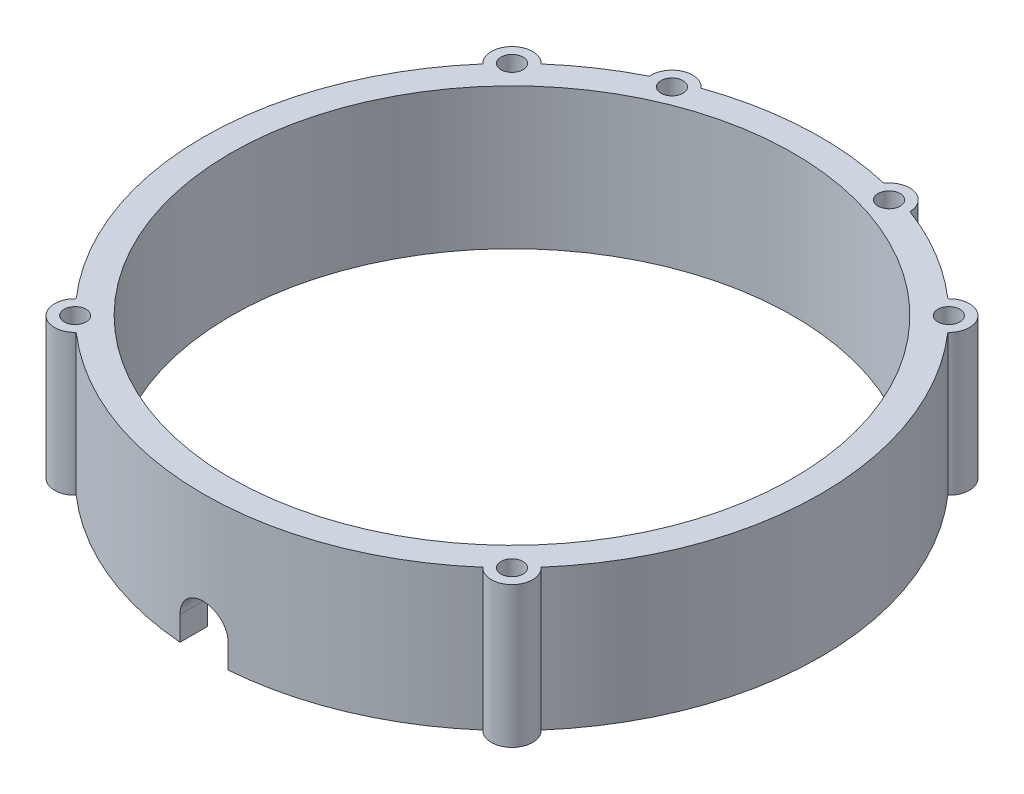
ISO-10303-21;
HEADER;
FILE_DESCRIPTION(('STEP AP214'),'2;1');
FILE_NAME('part.step','',(''),(''),'','','');
FILE_SCHEMA(('AUTOMOTIVE_DESIGN { 1 0 10303 214 1 1 1 1 }'));
ENDSEC;
DATA;
#1=APPLICATION_CONTEXT('core data for automotive mechanical design processes');
#2=APPLICATION_PROTOCOL_DEFINITION('international standard','automotive_design',2000,#1);
#3=PRODUCT_CONTEXT('',#1,'mechanical');
#4=PRODUCT('Part','Part','',(#3));
#5=PRODUCT_RELATED_PRODUCT_CATEGORY('part','',(#4));
#6=PRODUCT_DEFINITION_FORMATION('','',#4);
#7=PRODUCT_DEFINITION_CONTEXT('part definition',#1,'design');
#8=PRODUCT_DEFINITION('design','',#6,#7);
#9=PRODUCT_DEFINITION_SHAPE('','',#8);
#10=(LENGTH_UNIT() NAMED_UNIT(*) SI_UNIT(.MILLI.,.METRE.));
#11=(NAMED_UNIT(*) PLANE_ANGLE_UNIT() SI_UNIT($,.RADIAN.));
#12=(NAMED_UNIT(*) SI_UNIT($,.STERADIAN.) SOLID_ANGLE_UNIT());
#13=UNCERTAINTY_MEASURE_WITH_UNIT(LENGTH_MEASURE(1.E-05),#10,'distance_accuracy_value','');
#14=(GEOMETRIC_REPRESENTATION_CONTEXT(3) GLOBAL_UNCERTAINTY_ASSIGNED_CONTEXT((#13)) GLOBAL_UNIT_ASSIGNED_CONTEXT((#10,
#11,#12)) REPRESENTATION_CONTEXT('',''));
#15=CARTESIAN_POINT('',(0.,0.,0.));
#16=DIRECTION('',(0.,0.,1.));
#17=DIRECTION('',(1.,0.,0.));
#18=AXIS2_PLACEMENT_3D('',#15,#16,#17);
#19=CARTESIAN_POINT('',(0.,0.,0.));
#20=DIRECTION('',(0.,1.,0.));
#21=DIRECTION('',(0.,0.,1.));
#22=AXIS2_PLACEMENT_3D('',#19,#20,#21);
#23=PLANE('',#22);
#24=CARTESIAN_POINT('',(-17.1530965406792,0.,-40.4101630665621));
#25=DIRECTION('',(0.,1.,0.));
#26=DIRECTION('',(0.,0.,1.));
#27=AXIS2_PLACEMENT_3D('',#24,#25,#26);
#28=CIRCLE('',#27,1.6);
#29=CARTESIAN_POINT('',(-17.1530965406792,0.,-38.8101630665621));
#30=VERTEX_POINT('',#29);
#31=EDGE_CURVE('E250',#30,#30,#28,.T.);
#32=ORIENTED_EDGE('',*,*,#31,.T.);
#33=EDGE_LOOP('',(#32));
#34=FACE_BOUND('',#33,.T.);
#35=CARTESIAN_POINT('',(12.8351178373282,0.,-41.9817787867772));
#36=DIRECTION('',(0.,1.,0.));
#37=DIRECTION('',(0.,0.,1.));
#38=AXIS2_PLACEMENT_3D('',#35,#36,#37);
#39=CIRCLE('',#38,1.6);
#40=CARTESIAN_POINT('',(12.8351178373282,0.,-40.3817787867772));
#41=VERTEX_POINT('',#40);
#42=EDGE_CURVE('E254',#41,#41,#39,.T.);
#43=ORIENTED_EDGE('',*,*,#42,.T.);
#44=EDGE_LOOP('',(#43));
#45=FACE_BOUND('',#44,.T.);
#46=CARTESIAN_POINT('',(-31.7490944752759,0.,-31.749094475276));
#47=DIRECTION('',(0.,1.,0.));
#48=DIRECTION('',(0.,0.,1.));
#49=AXIS2_PLACEMENT_3D('',#46,#47,#48);
#50=CIRCLE('',#49,1.6);
#51=CARTESIAN_POINT('',(-31.7490944752759,0.,-30.149094475276));
#52=VERTEX_POINT('',#51);
#53=EDGE_CURVE('E258',#52,#52,#50,.T.);
#54=ORIENTED_EDGE('',*,*,#53,.T.);
#55=EDGE_LOOP('',(#54));
#56=FACE_BOUND('',#55,.T.);
#57=CARTESIAN_POINT('',(-31.749094475276,0.,31.7490944752759));
#58=DIRECTION('',(0.,1.,0.));
#59=DIRECTION('',(0.,0.,1.));
#60=AXIS2_PLACEMENT_3D('',#57,#58,#59);
#61=CIRCLE('',#60,1.6);
#62=CARTESIAN_POINT('',(-31.749094475276,0.,33.3490944752759));
#63=VERTEX_POINT('',#62);
#64=EDGE_CURVE('E262',#63,#63,#61,.T.);
#65=ORIENTED_EDGE('',*,*,#64,.T.);
#66=EDGE_LOOP('',(#65));
#67=FACE_BOUND('',#66,.T.);
#68=CARTESIAN_POINT('',(31.7490944752759,0.,31.749094475276));
#69=DIRECTION('',(0.,1.,0.));
#70=DIRECTION('',(0.,0.,1.));
#71=AXIS2_PLACEMENT_3D('',#68,#69,#70);
#72=CIRCLE('',#71,1.6);
#73=CARTESIAN_POINT('',(31.7490944752759,0.,33.349094475276));
#74=VERTEX_POINT('',#73);
#75=EDGE_CURVE('E266',#74,#74,#72,.T.);
#76=ORIENTED_EDGE('',*,*,#75,.T.);
#77=EDGE_LOOP('',(#76));
#78=FACE_BOUND('',#77,.T.);
#79=CARTESIAN_POINT('',(31.749094475276,0.,-31.7490944752759));
#80=DIRECTION('',(0.,1.,0.));
#81=DIRECTION('',(0.,0.,1.));
#82=AXIS2_PLACEMENT_3D('',#79,#80,#81);
#83=CIRCLE('',#82,1.6);
#84=CARTESIAN_POINT('',(31.749094475276,0.,-30.1490944752759));
#85=VERTEX_POINT('',#84);
#86=EDGE_CURVE('E269',#85,#85,#83,.T.);
#87=ORIENTED_EDGE('',*,*,#86,.T.);
#88=EDGE_LOOP('',(#87));
#89=FACE_BOUND('',#88,.T.);
#90=DIRECTION('',(0.,0.,-1.));
#91=VECTOR('',#90,1.);
#92=CARTESIAN_POINT('',(-3.5,0.,44.9));
#93=LINE('',#92,#91);
#94=CARTESIAN_POINT('',(-3.5,0.,44.7633778886268));
#95=VERTEX_POINT('',#94);
#96=CARTESIAN_POINT('',(-3.5,0.,40.7499693251418));
#97=VERTEX_POINT('',#96);
#98=EDGE_CURVE('E273',#95,#97,#93,.T.);
#99=ORIENTED_EDGE('',*,*,#98,.F.);
#100=CARTESIAN_POINT('',(0.,0.,0.));
#101=DIRECTION('',(0.,1.,0.));
#102=DIRECTION('',(0.,0.,1.));
#103=AXIS2_PLACEMENT_3D('',#100,#101,#102);
#104=CIRCLE('',#103,44.9);
#105=CARTESIAN_POINT('',(-29.5580900659073,0.,33.7983625587943));
#106=VERTEX_POINT('',#105);
#107=EDGE_CURVE('E274',#106,#95,#104,.T.);
#108=ORIENTED_EDGE('',*,*,#107,.F.);
#109=CARTESIAN_POINT('',(-31.749094475276,0.,31.7490944752759));
#110=DIRECTION('',(0.,1.,0.));
#111=DIRECTION('',(0.,0.,1.));
#112=AXIS2_PLACEMENT_3D('',#109,#110,#111);
#113=CIRCLE('',#112,3.00000000000016);
#114=CARTESIAN_POINT('',(-33.7983625587944,0.,29.5580900659072));
#115=VERTEX_POINT('',#114);
#116=EDGE_CURVE('E374',#106,#115,#113,.F.);
#117=ORIENTED_EDGE('',*,*,#116,.T.);
#118=CARTESIAN_POINT('',(0.,0.,0.));
#119=DIRECTION('',(0.,1.,0.));
#120=DIRECTION('',(0.,0.,1.));
#121=AXIS2_PLACEMENT_3D('',#118,#119,#120);
#122=CIRCLE('',#121,44.9);
#123=CARTESIAN_POINT('',(-33.7983625587945,0.,-29.5580900659072));
#124=VERTEX_POINT('',#123);
#125=EDGE_CURVE('E285',#124,#115,#122,.T.);
#126=ORIENTED_EDGE('',*,*,#125,.F.);
#127=CARTESIAN_POINT('',(-31.7490944752759,0.,-31.749094475276));
#128=DIRECTION('',(0.,1.,0.));
#129=DIRECTION('',(0.,0.,1.));
#130=AXIS2_PLACEMENT_3D('',#127,#128,#129);
#131=CIRCLE('',#130,3.00000000000023);
#132=CARTESIAN_POINT('',(-29.558090065907,0.,-33.7983625587946));
#133=VERTEX_POINT('',#132);
#134=EDGE_CURVE('E83',#124,#133,#131,.F.);
#135=ORIENTED_EDGE('',*,*,#134,.T.);
#136=CARTESIAN_POINT('',(0.,0.,0.));
#137=DIRECTION('',(0.,1.,0.));
#138=DIRECTION('',(0.,0.,1.));
#139=AXIS2_PLACEMENT_3D('',#136,#137,#138);
#140=CIRCLE('',#139,44.9);
#141=CARTESIAN_POINT('',(-20.1399570386959,0.,-40.1296913828089));
#142=VERTEX_POINT('',#141);
#143=EDGE_CURVE('E192',#142,#133,#140,.T.);
#144=ORIENTED_EDGE('',*,*,#143,.F.);
#145=CARTESIAN_POINT('',(-17.1530965406792,0.,-40.4101630665621));
#146=DIRECTION('',(0.,1.,0.));
#147=DIRECTION('',(0.,0.,1.));
#148=AXIS2_PLACEMENT_3D('',#145,#146,#147);
#149=CIRCLE('',#148,2.99999999999996);
#150=CARTESIAN_POINT('',(-14.8764944493469,0.,-42.3638986980489));
#151=VERTEX_POINT('',#150);
#152=EDGE_CURVE('E301',#151,#142,#149,.T.);
#153=ORIENTED_EDGE('',*,*,#152,.F.);
#154=CARTESIAN_POINT('',(0.,0.,0.));
#155=DIRECTION('',(0.,1.,0.));
#156=DIRECTION('',(0.,0.,1.));
#157=AXIS2_PLACEMENT_3D('',#154,#155,#156);
#158=CIRCLE('',#157,44.9);
#159=CARTESIAN_POINT('',(10.3667662272664,0.,-43.6868419319732));
#160=VERTEX_POINT('',#159);
#161=EDGE_CURVE('E189',#160,#151,#158,.T.);
#162=ORIENTED_EDGE('',*,*,#161,.F.);
#163=CARTESIAN_POINT('',(12.8351178373282,0.,-41.9817787867772));
#164=DIRECTION('',(0.,1.,0.));
#165=DIRECTION('',(0.,0.,1.));
#166=AXIS2_PLACEMENT_3D('',#163,#164,#165);
#167=CIRCLE('',#166,2.99999999999996);
#168=CARTESIAN_POINT('',(15.8349332751091,0.,-42.0150554941064));
#169=VERTEX_POINT('',#168);
#170=EDGE_CURVE('E299',#169,#160,#167,.T.);
#171=ORIENTED_EDGE('',*,*,#170,.F.);
#172=CARTESIAN_POINT('',(0.,0.,0.));
#173=DIRECTION('',(0.,1.,0.));
#174=DIRECTION('',(0.,0.,1.));
#175=AXIS2_PLACEMENT_3D('',#172,#173,#174);
#176=CIRCLE('',#175,44.9);
#177=CARTESIAN_POINT('',(29.5580900659073,0.,-33.7983625587944));
#178=VERTEX_POINT('',#177);
#179=EDGE_CURVE('E297',#178,#169,#176,.T.);
#180=ORIENTED_EDGE('',*,*,#179,.F.);
#181=CARTESIAN_POINT('',(31.749094475276,0.,-31.7490944752759));
#182=DIRECTION('',(0.,1.,0.));
#183=DIRECTION('',(0.,0.,1.));
#184=AXIS2_PLACEMENT_3D('',#181,#182,#183);
#185=CIRCLE('',#184,3.00000000000001);
#186=CARTESIAN_POINT('',(33.7983625587945,0.,-29.5580900659072));
#187=VERTEX_POINT('',#186);
#188=EDGE_CURVE('E383',#178,#187,#185,.F.);
#189=ORIENTED_EDGE('',*,*,#188,.T.);
#190=CARTESIAN_POINT('',(0.,0.,0.));
#191=DIRECTION('',(0.,1.,0.));
#192=DIRECTION('',(0.,0.,1.));
#193=AXIS2_PLACEMENT_3D('',#190,#191,#192);
#194=CIRCLE('',#193,44.9);
#195=CARTESIAN_POINT('',(33.7983625587944,0.,29.5580900659073));
#196=VERTEX_POINT('',#195);
#197=EDGE_CURVE('E289',#196,#187,#194,.T.);
#198=ORIENTED_EDGE('',*,*,#197,.F.);
#199=CARTESIAN_POINT('',(31.7490944752759,0.,31.749094475276));
#200=DIRECTION('',(0.,1.,0.));
#201=DIRECTION('',(0.,0.,1.));
#202=AXIS2_PLACEMENT_3D('',#199,#200,#201);
#203=CIRCLE('',#202,3.00000000000008);
#204=CARTESIAN_POINT('',(29.5580900659072,0.,33.7983625587945));
#205=VERTEX_POINT('',#204);
#206=EDGE_CURVE('E378',#196,#205,#203,.F.);
#207=ORIENTED_EDGE('',*,*,#206,.T.);
#208=CARTESIAN_POINT('',(3.5,0.,44.7633778886268));
#209=VERTEX_POINT('',#208);
#210=EDGE_CURVE('E286',#209,#205,#104,.T.);
#211=ORIENTED_EDGE('',*,*,#210,.F.);
#212=DIRECTION('',(0.,0.,-1.));
#213=VECTOR('',#212,1.);
#214=CARTESIAN_POINT('',(3.5,0.,44.9));
#215=LINE('',#214,#213);
#216=CARTESIAN_POINT('',(3.5,0.,40.7499693251418));
#217=VERTEX_POINT('',#216);
#218=EDGE_CURVE('E75',#209,#217,#215,.T.);
#219=ORIENTED_EDGE('',*,*,#218,.T.);
#220=CARTESIAN_POINT('',(0.,0.,0.));
#221=DIRECTION('',(0.,1.,0.));
#222=DIRECTION('',(0.,0.,1.));
#223=AXIS2_PLACEMENT_3D('',#220,#221,#222);
#224=CIRCLE('',#223,40.9);
#225=EDGE_CURVE('E276',#217,#97,#224,.T.);
#226=ORIENTED_EDGE('',*,*,#225,.T.);
#227=EDGE_LOOP('',(#99,#108,#117,#126,#135,#144,#153,#162,#171,#180,#189,#198,#207,#211,#219,#226));
#228=FACE_BOUND('',#227,.T.);
#229=ADVANCED_FACE('F61',(#34,#45,#56,#67,#78,#89,#228),#23,.F.);
#230=CARTESIAN_POINT('',(0.,20.5,0.));
#231=DIRECTION('',(0.,-1.,0.));
#232=DIRECTION('',(0.,0.,-1.));
#233=AXIS2_PLACEMENT_3D('',#230,#231,#232);
#234=CYLINDRICAL_SURFACE('',#233,40.9);
#235=CARTESIAN_POINT('',(0.,20.5,0.));
#236=DIRECTION('',(0.,1.,0.));
#237=DIRECTION('',(0.,0.,1.));
#238=AXIS2_PLACEMENT_3D('',#235,#236,#237);
#239=CIRCLE('',#238,40.9);
#240=CARTESIAN_POINT('',(0.,20.5,40.9));
#241=VERTEX_POINT('',#240);
#242=EDGE_CURVE('E291',#241,#241,#239,.T.);
#243=ORIENTED_EDGE('',*,*,#242,.T.);
#244=EDGE_LOOP('',(#243));
#245=FACE_BOUND('',#244,.T.);
#246=CARTESIAN_POINT('',(3.5,3.5,40.7499693251418));
#247=CARTESIAN_POINT('',(3.50000964048092,3.59824909595129,40.749965842796));
#248=CARTESIAN_POINT('',(3.49586309882002,3.6964934745691,40.7503245730504));
#249=CARTESIAN_POINT('',(3.47933229120163,3.89227581227809,40.7517407338276));
#250=CARTESIAN_POINT('',(3.46694853151288,3.98981381441155,40.7527981214102));
#251=CARTESIAN_POINT('',(3.43403195642768,4.18341604896146,40.7555846887573));
#252=CARTESIAN_POINT('',(3.41350610156376,4.27948146759436,40.7573132946826));
#253=CARTESIAN_POINT('',(3.36447463084468,4.46951172588773,40.7613899407994));
#254=CARTESIAN_POINT('',(3.33596908892979,4.56347658500341,40.7637379752512));
#255=CARTESIAN_POINT('',(3.23872360136853,4.8413004568433,40.771619643036));
#256=CARTESIAN_POINT('',(3.15823856935434,5.02118364135841,40.777992301763));
#257=CARTESIAN_POINT('',(2.96837303193688,5.36476235218107,40.7922512329031));
#258=CARTESIAN_POINT('',(2.85899659413601,5.52846015276317,40.8001372922029));
#259=CARTESIAN_POINT('',(2.61411506768439,5.83560318623674,40.816558601666));
#260=CARTESIAN_POINT('',(2.4785503330118,5.97900086673616,40.82509530633));
#261=CARTESIAN_POINT('',(2.18525779678196,6.24104642540193,40.841843498283));
#262=CARTESIAN_POINT('',(2.0275266267288,6.35969053510023,40.8500549358998));
#263=CARTESIAN_POINT('',(1.69409556703837,6.56901322890935,40.8652406224087));
#264=CARTESIAN_POINT('',(1.5183690361253,6.65964952802438,40.8722129939341));
#265=CARTESIAN_POINT('',(1.15413303232907,6.8101056987528,40.8841184594225));
#266=CARTESIAN_POINT('',(0.965624570891555,6.86992800549212,40.8890517145241));
#267=CARTESIAN_POINT('',(0.581655814625003,6.95692512339592,40.8963132582187));
#268=CARTESIAN_POINT('',(0.3862136861428,6.98417957347958,40.8986479002963));
#269=CARTESIAN_POINT('',(-0.00648882199237249,7.00551348326747,40.9004707320439));
#270=CARTESIAN_POINT('',(-0.203749210773618,6.99959277633064,40.899958907416));
#271=CARTESIAN_POINT('',(-0.593937852867385,6.95480839186038,40.8961516085632));
#272=CARTESIAN_POINT('',(-0.786876127210241,6.91603131467869,40.8928634520649));
#273=CARTESIAN_POINT('',(-1.16349461085666,6.80676973727158,40.883881738657));
#274=CARTESIAN_POINT('',(-1.34717477241873,6.73628507355762,40.8781881693447));
#275=CARTESIAN_POINT('',(-1.70034273168692,6.56551126813345,40.8650233971963));
#276=CARTESIAN_POINT('',(-1.8698114189533,6.46518279336582,40.8575498510228));
#277=CARTESIAN_POINT('',(-2.189528531622,6.23760241788658,40.8416653177443));
#278=CARTESIAN_POINT('',(-2.33977742444571,6.11035117213094,40.8332543534466));
#279=CARTESIAN_POINT('',(-2.61728543737407,5.83207011346642,40.8164090153748));
#280=CARTESIAN_POINT('',(-2.7444724566926,5.68096839764916,40.8079746491316));
#281=CARTESIAN_POINT('',(-2.9717262837295,5.35946127711144,40.7920564292353));
#282=CARTESIAN_POINT('',(-3.07178474606407,5.18904995510817,40.7845728684478));
#283=CARTESIAN_POINT('',(-3.24193509477707,4.83368751845717,40.7714014180471));
#284=CARTESIAN_POINT('',(-3.31200505210223,4.64872588051051,40.7657148432699));
#285=CARTESIAN_POINT('',(-3.41996920170108,4.26974302575383,40.7568005895101));
#286=CARTESIAN_POINT('',(-3.45791218300174,4.07573602001078,40.7535691828021));
#287=CARTESIAN_POINT('',(-3.48619850630497,3.81699106052656,40.7511525795988));
#288=CARTESIAN_POINT('',(-3.49137668341357,3.75364822686948,40.7507091245758));
#289=CARTESIAN_POINT('',(-3.49827274151485,3.62687899817979,40.7501178708733));
#290=CARTESIAN_POINT('',(-3.49999638097419,3.56345291885567,40.7499695801789));
#291=CARTESIAN_POINT('',(-3.5,3.5,40.7499693251418));
#292=B_SPLINE_CURVE_WITH_KNOTS('',3,(#246,#247,#248,#249,#250,#251,#252,#253,#254,#255,#256,
#257,#258,#259,#260,#261,#262,#263,#264,#265,#266,#267,#268,#269,#270,#271,#272,#273,#274,#275,
#276,#277,#278,#279,#280,#281,#282,#283,#284,#285,#286,#287,#288,#289,#290,#291),.UNSPECIFIED.,
.F.,.F.,(4,2,2,2,2,2,2,2,2,2,2,2,2,2,2,2,2,2,2,2,2,2,4),(0.,0.294650714459899,0.589283321026421,
0.883664592366965,1.17804313604296,1.76651506364897,2.35490418479021,2.9446495566645,
3.53448464559534,4.12520593995873,4.71588054444503,5.30510778367457,5.89433798263518,
6.48201994670111,7.06970494096827,7.65816794060906,8.24661662623089,8.83687446029531,
9.42731366609712,10.0181838951009,10.6081551925136,10.7987547004879,10.989036227611),.UNSPECIFIED.);
#293=CARTESIAN_POINT('',(3.5,3.5,40.7499693251418));
#294=VERTEX_POINT('',#293);
#295=CARTESIAN_POINT('',(-3.5,3.5,40.7499693251418));
#296=VERTEX_POINT('',#295);
#297=EDGE_CURVE('E185',#294,#296,#292,.T.);
#298=ORIENTED_EDGE('',*,*,#297,.T.);
#299=DIRECTION('',(0.,-1.,0.));
#300=VECTOR('',#299,1.);
#301=CARTESIAN_POINT('',(-3.5,20.5,40.7499693251418));
#302=LINE('',#301,#300);
#303=EDGE_CURVE('E222',#296,#97,#302,.T.);
#304=ORIENTED_EDGE('',*,*,#303,.T.);
#305=ORIENTED_EDGE('',*,*,#225,.F.);
#306=DIRECTION('',(0.,-1.,0.));
#307=VECTOR('',#306,1.);
#308=CARTESIAN_POINT('',(3.5,20.5,40.7499693251418));
#309=LINE('',#308,#307);
#310=EDGE_CURVE('E653',#217,#294,#309,.F.);
#311=ORIENTED_EDGE('',*,*,#310,.T.);
#312=EDGE_LOOP('',(#298,#304,#305,#311));
#313=FACE_BOUND('',#312,.T.);
#314=ADVANCED_FACE('F225',(#245,#313),#234,.F.);
#315=CARTESIAN_POINT('',(0.,-4.5,0.));
#316=DIRECTION('',(0.,1.,0.));
#317=DIRECTION('',(0.,0.,1.));
#318=AXIS2_PLACEMENT_3D('',#315,#316,#317);
#319=CYLINDRICAL_SURFACE('',#318,44.9);
#320=DIRECTION('',(0.,1.,0.));
#321=VECTOR('',#320,1.);
#322=CARTESIAN_POINT('',(-3.5,-4.5,44.7633778886268));
#323=LINE('',#322,#321);
#324=CARTESIAN_POINT('',(-3.5,3.5,44.7633778886268));
#325=VERTEX_POINT('',#324);
#326=EDGE_CURVE('E12',#95,#325,#323,.T.);
#327=ORIENTED_EDGE('',*,*,#326,.T.);
#328=CARTESIAN_POINT('',(-3.5,3.5,44.7633778886268));
#329=CARTESIAN_POINT('',(-3.50000960474246,3.59828171982175,44.7633747208575));
#330=CARTESIAN_POINT('',(-3.49586034826426,3.69655876405734,44.7637015006138));
#331=CARTESIAN_POINT('',(-3.4793184710148,3.89240680463495,44.7649915561636));
#332=CARTESIAN_POINT('',(-3.4669263377296,3.98997784238547,44.7659547943169));
#333=CARTESIAN_POINT('',(-3.43398668263772,4.18364879850476,44.7684933220832));
#334=CARTESIAN_POINT('',(-3.41344591768482,4.27974986737787,44.7700681045802));
#335=CARTESIAN_POINT('',(-3.36437794371068,4.46985114531916,44.7737820678763));
#336=CARTESIAN_POINT('',(-3.33585081263611,4.56385137488179,44.7759212431667));
#337=CARTESIAN_POINT('',(-3.23852912061639,4.84178232482582,44.7831020607386));
#338=CARTESIAN_POINT('',(-3.15797840212347,5.02173601956829,44.788908294715));
#339=CARTESIAN_POINT('',(-2.96795250729651,5.36544134164519,44.8019002210702));
#340=CARTESIAN_POINT('',(-2.85848167626447,5.52919539792998,44.8090857061696));
#341=CARTESIAN_POINT('',(-2.61343506049279,5.83636610914623,44.8240450387007));
#342=CARTESIAN_POINT('',(-2.47780966099231,5.97974319683933,44.8318199870465));
#343=CARTESIAN_POINT('',(-2.18439915685326,6.24173254690161,44.8470727855947));
#344=CARTESIAN_POINT('',(-2.02661068406102,6.3603410383265,44.8545505904178));
#345=CARTESIAN_POINT('',(-1.69312208733441,6.56954835007493,44.8683761788688));
#346=CARTESIAN_POINT('',(-1.51740003993265,6.66011232770159,44.8747225526807));
#347=CARTESIAN_POINT('',(-1.15319741077576,6.81042932323622,44.8855576901581));
#348=CARTESIAN_POINT('',(-0.964717805627964,6.87018469657127,44.8900465958285));
#349=CARTESIAN_POINT('',(-0.580746484207755,6.95707978419725,44.896653646246));
#350=CARTESIAN_POINT('',(-0.385269791588704,6.98428551348533,44.8987765888788));
#351=CARTESIAN_POINT('',(0.00749106443814212,7.00551299815313,44.9004287708202));
#352=CARTESIAN_POINT('',(0.204775242419055,6.99953448574449,44.8999579891982));
#353=CARTESIAN_POINT('',(0.595092566471804,6.95461619334253,44.8964796440063));
#354=CARTESIAN_POINT('',(0.788134049970819,6.91574837273816,44.8934776186624));
#355=CARTESIAN_POINT('',(1.16494379372431,6.80626672219239,44.8852809322363));
#356=CARTESIAN_POINT('',(1.34871201873726,6.73565277161502,44.8800862628221));
#357=CARTESIAN_POINT('',(1.70199277888392,6.56460121429222,44.8680791800231));
#358=CARTESIAN_POINT('',(1.87148929792201,6.46413065936686,44.8612649810827));
#359=CARTESIAN_POINT('',(2.19123160829209,6.23624641923475,44.8467853759798));
#360=CARTESIAN_POINT('',(2.34147794913615,6.10883350339501,44.8391199941267));
#361=CARTESIAN_POINT('',(2.61886455442493,5.83029622846735,44.8237764714614));
#362=CARTESIAN_POINT('',(2.74594543845943,5.67911273333173,44.8160983473912));
#363=CARTESIAN_POINT('',(2.97297258122708,5.35746709132314,44.8016118259601));
#364=CARTESIAN_POINT('',(3.07291044343098,5.18699900192559,44.7948036980713));
#365=CARTESIAN_POINT('',(3.24280796962679,4.8315604204994,44.7828257691834));
#366=CARTESIAN_POINT('',(3.31274657128627,4.64657984676228,44.7776571199151));
#367=CARTESIAN_POINT('',(3.42045056804077,4.26759271096918,44.7695597889626));
#368=CARTESIAN_POINT('',(3.45826480519031,4.07360032590709,44.7666277074842));
#369=CARTESIAN_POINT('',(3.48635165661392,3.81523073526899,44.7644431198624));
#370=CARTESIAN_POINT('',(3.49147239473944,3.75223833281094,44.7640438906619));
#371=CARTESIAN_POINT('',(3.49829192248696,3.6261726098262,44.7635116149658));
#372=CARTESIAN_POINT('',(3.49999639902261,3.56309959896164,44.7633781261055));
#373=CARTESIAN_POINT('',(3.5,3.5,44.7633778886268));
#374=B_SPLINE_CURVE_WITH_KNOTS('',3,(#328,#329,#330,#331,#332,#333,#334,#335,#336,#337,#338,
#339,#340,#341,#342,#343,#344,#345,#346,#347,#348,#349,#350,#351,#352,#353,#354,#355,#356,#357,
#358,#359,#360,#361,#362,#363,#364,#365,#366,#367,#368,#369,#370,#371,#372,#373),.UNSPECIFIED.,
.F.,.F.,(4,2,2,2,2,2,2,2,2,2,2,2,2,2,2,2,2,2,2,2,2,2,4),(0.,0.294748677234381,0.589479924498616,
0.883967289435624,1.17845178028568,1.7671421103556,2.35574403883908,2.94547371814697,
3.53529311667219,4.12584239776252,4.71634652256789,5.30565098542284,5.8949602038209,
6.48298338088558,7.07100879246993,7.65968554313867,8.24834548580258,8.83849375953549,
9.42882438466605,10.0195688022804,10.6094134332371,10.7989517008767,10.9881741888364),.UNSPECIFIED.);
#375=CARTESIAN_POINT('',(3.5,3.5,44.7633778886268));
#376=VERTEX_POINT('',#375);
#377=EDGE_CURVE('E179',#325,#376,#374,.T.);
#378=ORIENTED_EDGE('',*,*,#377,.T.);
#379=DIRECTION('',(0.,1.,0.));
#380=VECTOR('',#379,1.);
#381=CARTESIAN_POINT('',(3.5,-4.5,44.7633778886268));
#382=LINE('',#381,#380);
#383=EDGE_CURVE('E68',#376,#209,#382,.F.);
#384=ORIENTED_EDGE('',*,*,#383,.T.);
#385=ORIENTED_EDGE('',*,*,#210,.T.);
#386=DIRECTION('',(0.,1.,0.));
#387=VECTOR('',#386,1.);
#388=CARTESIAN_POINT('',(29.5580900659072,-4.5,33.7983625587945));
#389=LINE('',#388,#387);
#390=CARTESIAN_POINT('',(29.5580900659072,20.5,33.7983625587945));
#391=VERTEX_POINT('',#390);
#392=EDGE_CURVE('E357',#205,#391,#389,.T.);
#393=ORIENTED_EDGE('',*,*,#392,.T.);
#394=CARTESIAN_POINT('',(0.,20.5,0.));
#395=DIRECTION('',(0.,1.,0.));
#396=DIRECTION('',(0.,0.,1.));
#397=AXIS2_PLACEMENT_3D('',#394,#395,#396);
#398=CIRCLE('',#397,44.9);
#399=CARTESIAN_POINT('',(-29.5580900659073,20.5,33.7983625587943));
#400=VERTEX_POINT('',#399);
#401=EDGE_CURVE('E354',#400,#391,#398,.T.);
#402=ORIENTED_EDGE('',*,*,#401,.F.);
#403=DIRECTION('',(0.,1.,0.));
#404=VECTOR('',#403,1.);
#405=CARTESIAN_POINT('',(-29.5580900659073,-4.5,33.7983625587943));
#406=LINE('',#405,#404);
#407=EDGE_CURVE('E284',#106,#400,#406,.T.);
#408=ORIENTED_EDGE('',*,*,#407,.F.);
#409=ORIENTED_EDGE('',*,*,#107,.T.);
#410=EDGE_LOOP('',(#327,#378,#384,#385,#393,#402,#408,#409));
#411=FACE_BOUND('',#410,.T.);
#412=ADVANCED_FACE('F187',(#411),#319,.T.);
#413=CARTESIAN_POINT('',(0.,20.5,0.));
#414=DIRECTION('',(0.,1.,0.));
#415=DIRECTION('',(0.,0.,1.));
#416=AXIS2_PLACEMENT_3D('',#413,#414,#415);
#417=PLANE('',#416);
#418=CARTESIAN_POINT('',(31.749094475276,20.5,-31.7490944752759));
#419=DIRECTION('',(0.,1.,0.));
#420=DIRECTION('',(0.,0.,1.));
#421=AXIS2_PLACEMENT_3D('',#418,#419,#420);
#422=CIRCLE('',#421,1.6);
#423=CARTESIAN_POINT('',(31.749094475276,20.5,-30.1490944752759));
#424=VERTEX_POINT('',#423);
#425=EDGE_CURVE('E316',#424,#424,#422,.T.);
#426=ORIENTED_EDGE('',*,*,#425,.F.);
#427=EDGE_LOOP('',(#426));
#428=FACE_BOUND('',#427,.T.);
#429=CARTESIAN_POINT('',(31.7490944752759,20.5,31.749094475276));
#430=DIRECTION('',(0.,1.,0.));
#431=DIRECTION('',(0.,0.,1.));
#432=AXIS2_PLACEMENT_3D('',#429,#430,#431);
#433=CIRCLE('',#432,1.6);
#434=CARTESIAN_POINT('',(31.7490944752759,20.5,33.349094475276));
#435=VERTEX_POINT('',#434);
#436=EDGE_CURVE('E319',#435,#435,#433,.T.);
#437=ORIENTED_EDGE('',*,*,#436,.F.);
#438=EDGE_LOOP('',(#437));
#439=FACE_BOUND('',#438,.T.);
#440=CARTESIAN_POINT('',(-31.749094475276,20.5,31.7490944752759));
#441=DIRECTION('',(0.,1.,0.));
#442=DIRECTION('',(0.,0.,1.));
#443=AXIS2_PLACEMENT_3D('',#440,#441,#442);
#444=CIRCLE('',#443,1.6);
#445=CARTESIAN_POINT('',(-31.749094475276,20.5,33.3490944752759));
#446=VERTEX_POINT('',#445);
#447=EDGE_CURVE('E362',#446,#446,#444,.T.);
#448=ORIENTED_EDGE('',*,*,#447,.F.);
#449=EDGE_LOOP('',(#448));
#450=FACE_BOUND('',#449,.T.);
#451=CARTESIAN_POINT('',(-31.7490944752759,20.5,-31.749094475276));
#452=DIRECTION('',(0.,1.,0.));
#453=DIRECTION('',(0.,0.,1.));
#454=AXIS2_PLACEMENT_3D('',#451,#452,#453);
#455=CIRCLE('',#454,1.6);
#456=CARTESIAN_POINT('',(-31.7490944752759,20.5,-30.149094475276));
#457=VERTEX_POINT('',#456);
#458=EDGE_CURVE('E365',#457,#457,#455,.T.);
#459=ORIENTED_EDGE('',*,*,#458,.F.);
#460=EDGE_LOOP('',(#459));
#461=FACE_BOUND('',#460,.T.);
#462=CARTESIAN_POINT('',(12.8351178373282,20.5,-41.9817787867772));
#463=DIRECTION('',(0.,1.,0.));
#464=DIRECTION('',(0.,0.,1.));
#465=AXIS2_PLACEMENT_3D('',#462,#463,#464);
#466=CIRCLE('',#465,1.6);
#467=CARTESIAN_POINT('',(12.8351178373282,20.5,-40.3817787867772));
#468=VERTEX_POINT('',#467);
#469=EDGE_CURVE('E389',#468,#468,#466,.T.);
#470=ORIENTED_EDGE('',*,*,#469,.F.);
#471=EDGE_LOOP('',(#470));
#472=FACE_BOUND('',#471,.T.);
#473=ORIENTED_EDGE('',*,*,#242,.F.);
#474=EDGE_LOOP('',(#473));
#475=FACE_BOUND('',#474,.T.);
#476=CARTESIAN_POINT('',(-17.1530965406792,20.5,-40.4101630665621));
#477=DIRECTION('',(0.,1.,0.));
#478=DIRECTION('',(0.,0.,1.));
#479=AXIS2_PLACEMENT_3D('',#476,#477,#478);
#480=CIRCLE('',#479,1.6);
#481=CARTESIAN_POINT('',(-17.1530965406792,20.5,-38.8101630665621));
#482=VERTEX_POINT('',#481);
#483=EDGE_CURVE('E385',#482,#482,#480,.T.);
#484=ORIENTED_EDGE('',*,*,#483,.F.);
#485=EDGE_LOOP('',(#484));
#486=FACE_BOUND('',#485,.T.);
#487=CARTESIAN_POINT('',(0.,20.5,0.));
#488=DIRECTION('',(0.,1.,0.));
#489=DIRECTION('',(0.,0.,1.));
#490=AXIS2_PLACEMENT_3D('',#487,#488,#489);
#491=CIRCLE('',#490,44.9);
#492=CARTESIAN_POINT('',(10.3667662272664,20.5,-43.6868419319732));
#493=VERTEX_POINT('',#492);
#494=CARTESIAN_POINT('',(-14.8764944493469,20.5,-42.3638986980489));
#495=VERTEX_POINT('',#494);
#496=EDGE_CURVE('E221',#493,#495,#491,.T.);
#497=ORIENTED_EDGE('',*,*,#496,.T.);
#498=CARTESIAN_POINT('',(-17.1530965406792,20.5,-40.4101630665621));
#499=DIRECTION('',(0.,1.,0.));
#500=DIRECTION('',(0.,0.,1.));
#501=AXIS2_PLACEMENT_3D('',#498,#499,#500);
#502=CIRCLE('',#501,2.99999999999996);
#503=CARTESIAN_POINT('',(-20.1399570386959,20.5,-40.1296913828089));
#504=VERTEX_POINT('',#503);
#505=EDGE_CURVE('E321',#495,#504,#502,.T.);
#506=ORIENTED_EDGE('',*,*,#505,.T.);
#507=CARTESIAN_POINT('',(0.,20.5,0.));
#508=DIRECTION('',(0.,1.,0.));
#509=DIRECTION('',(0.,0.,1.));
#510=AXIS2_PLACEMENT_3D('',#507,#508,#509);
#511=CIRCLE('',#510,44.9);
#512=CARTESIAN_POINT('',(-29.558090065907,20.5,-33.7983625587946));
#513=VERTEX_POINT('',#512);
#514=EDGE_CURVE('E336',#504,#513,#511,.T.);
#515=ORIENTED_EDGE('',*,*,#514,.T.);
#516=CARTESIAN_POINT('',(-31.7490944752759,20.5,-31.749094475276));
#517=DIRECTION('',(0.,1.,0.));
#518=DIRECTION('',(0.,0.,1.));
#519=AXIS2_PLACEMENT_3D('',#516,#517,#518);
#520=CIRCLE('',#519,3.00000000000023);
#521=CARTESIAN_POINT('',(-33.7983625587945,20.5,-29.5580900659072));
#522=VERTEX_POINT('',#521);
#523=EDGE_CURVE('E315',#513,#522,#520,.T.);
#524=ORIENTED_EDGE('',*,*,#523,.T.);
#525=CARTESIAN_POINT('',(0.,20.5,0.));
#526=DIRECTION('',(0.,1.,0.));
#527=DIRECTION('',(0.,0.,1.));
#528=AXIS2_PLACEMENT_3D('',#525,#526,#527);
#529=CIRCLE('',#528,44.9);
#530=CARTESIAN_POINT('',(-33.7983625587944,20.5,29.5580900659072));
#531=VERTEX_POINT('',#530);
#532=EDGE_CURVE('E347',#522,#531,#529,.T.);
#533=ORIENTED_EDGE('',*,*,#532,.T.);
#534=CARTESIAN_POINT('',(-31.749094475276,20.5,31.7490944752759));
#535=DIRECTION('',(0.,1.,0.));
#536=DIRECTION('',(0.,0.,1.));
#537=AXIS2_PLACEMENT_3D('',#534,#535,#536);
#538=CIRCLE('',#537,3.00000000000016);
#539=EDGE_CURVE('E372',#531,#400,#538,.T.);
#540=ORIENTED_EDGE('',*,*,#539,.T.);
#541=ORIENTED_EDGE('',*,*,#401,.T.);
#542=CARTESIAN_POINT('',(31.7490944752759,20.5,31.749094475276));
#543=DIRECTION('',(0.,1.,0.));
#544=DIRECTION('',(0.,0.,1.));
#545=AXIS2_PLACEMENT_3D('',#542,#543,#544);
#546=CIRCLE('',#545,3.00000000000008);
#547=CARTESIAN_POINT('',(33.7983625587944,20.5,29.5580900659073));
#548=VERTEX_POINT('',#547);
#549=EDGE_CURVE('E376',#391,#548,#546,.T.);
#550=ORIENTED_EDGE('',*,*,#549,.T.);
#551=CARTESIAN_POINT('',(0.,20.5,0.));
#552=DIRECTION('',(0.,1.,0.));
#553=DIRECTION('',(0.,0.,1.));
#554=AXIS2_PLACEMENT_3D('',#551,#552,#553);
#555=CIRCLE('',#554,44.9);
#556=CARTESIAN_POINT('',(33.7983625587945,20.5,-29.5580900659072));
#557=VERTEX_POINT('',#556);
#558=EDGE_CURVE('E338',#548,#557,#555,.T.);
#559=ORIENTED_EDGE('',*,*,#558,.T.);
#560=CARTESIAN_POINT('',(31.749094475276,20.5,-31.7490944752759));
#561=DIRECTION('',(0.,1.,0.));
#562=DIRECTION('',(0.,0.,1.));
#563=AXIS2_PLACEMENT_3D('',#560,#561,#562);
#564=CIRCLE('',#563,3.00000000000001);
#565=CARTESIAN_POINT('',(29.5580900659073,20.5,-33.7983625587944));
#566=VERTEX_POINT('',#565);
#567=EDGE_CURVE('E381',#557,#566,#564,.T.);
#568=ORIENTED_EDGE('',*,*,#567,.T.);
#569=CARTESIAN_POINT('',(0.,20.5,0.));
#570=DIRECTION('',(0.,1.,0.));
#571=DIRECTION('',(0.,0.,1.));
#572=AXIS2_PLACEMENT_3D('',#569,#570,#571);
#573=CIRCLE('',#572,44.9);
#574=CARTESIAN_POINT('',(15.8349332751091,20.5,-42.0150554941064));
#575=VERTEX_POINT('',#574);
#576=EDGE_CURVE('E328',#566,#575,#573,.T.);
#577=ORIENTED_EDGE('',*,*,#576,.T.);
#578=CARTESIAN_POINT('',(12.8351178373282,20.5,-41.9817787867772));
#579=DIRECTION('',(0.,1.,0.));
#580=DIRECTION('',(0.,0.,1.));
#581=AXIS2_PLACEMENT_3D('',#578,#579,#580);
#582=CIRCLE('',#581,2.99999999999996);
#583=EDGE_CURVE('E326',#575,#493,#582,.T.);
#584=ORIENTED_EDGE('',*,*,#583,.T.);
#585=EDGE_LOOP('',(#497,#506,#515,#524,#533,#540,#541,#550,#559,#568,#577,#584));
#586=FACE_BOUND('',#585,.T.);
#587=ADVANCED_FACE('F232',(#428,#439,#450,#461,#472,#475,#486,#586),#417,.T.);
#588=CARTESIAN_POINT('',(12.8351178373282,20.5,-41.9817787867772));
#589=DIRECTION('',(0.,-1.,0.));
#590=DIRECTION('',(0.,0.,-1.));
#591=AXIS2_PLACEMENT_3D('',#588,#589,#590);
#592=CYLINDRICAL_SURFACE('',#591,1.6);
#593=ORIENTED_EDGE('',*,*,#469,.T.);
#594=EDGE_LOOP('',(#593));
#595=FACE_BOUND('',#594,.T.);
#596=ORIENTED_EDGE('',*,*,#42,.F.);
#597=EDGE_LOOP('',(#596));
#598=FACE_BOUND('',#597,.T.);
#599=ADVANCED_FACE('F230',(#595,#598),#592,.F.);
#600=CARTESIAN_POINT('',(-17.1530965406792,20.5,-40.4101630665621));
#601=DIRECTION('',(0.,-1.,0.));
#602=DIRECTION('',(0.,0.,-1.));
#603=AXIS2_PLACEMENT_3D('',#600,#601,#602);
#604=CYLINDRICAL_SURFACE('',#603,1.6);
#605=ORIENTED_EDGE('',*,*,#483,.T.);
#606=EDGE_LOOP('',(#605));
#607=FACE_BOUND('',#606,.T.);
#608=ORIENTED_EDGE('',*,*,#31,.F.);
#609=EDGE_LOOP('',(#608));
#610=FACE_BOUND('',#609,.T.);
#611=ADVANCED_FACE('F239',(#607,#610),#604,.F.);
#612=CARTESIAN_POINT('',(31.749094475276,-8.48528137423921,-31.7490944752759));
#613=DIRECTION('',(0.,1.,0.));
#614=DIRECTION('',(0.,0.,1.));
#615=AXIS2_PLACEMENT_3D('',#612,#613,#614);
#616=CYLINDRICAL_SURFACE('',#615,3.00000000000001);
#617=ORIENTED_EDGE('',*,*,#567,.F.);
#618=DIRECTION('',(0.,1.,0.));
#619=VECTOR('',#618,1.);
#620=CARTESIAN_POINT('',(33.7983625587945,-4.5,-29.5580900659072));
#621=LINE('',#620,#619);
#622=EDGE_CURVE('E329',#187,#557,#621,.T.);
#623=ORIENTED_EDGE('',*,*,#622,.F.);
#624=ORIENTED_EDGE('',*,*,#188,.F.);
#625=DIRECTION('',(0.,1.,0.));
#626=VECTOR('',#625,1.);
#627=CARTESIAN_POINT('',(29.5580900659073,-4.5,-33.7983625587944));
#628=LINE('',#627,#626);
#629=EDGE_CURVE('E333',#178,#566,#628,.T.);
#630=ORIENTED_EDGE('',*,*,#629,.T.);
#631=EDGE_LOOP('',(#617,#623,#624,#630));
#632=FACE_BOUND('',#631,.T.);
#633=ADVANCED_FACE('F432',(#632),#616,.T.);
#634=CARTESIAN_POINT('',(31.7490944752759,-8.48528137423921,31.749094475276));
#635=DIRECTION('',(0.,1.,0.));
#636=DIRECTION('',(0.,0.,1.));
#637=AXIS2_PLACEMENT_3D('',#634,#635,#636);
#638=CYLINDRICAL_SURFACE('',#637,3.00000000000008);
#639=ORIENTED_EDGE('',*,*,#549,.F.);
#640=ORIENTED_EDGE('',*,*,#392,.F.);
#641=ORIENTED_EDGE('',*,*,#206,.F.);
#642=DIRECTION('',(0.,1.,0.));
#643=VECTOR('',#642,1.);
#644=CARTESIAN_POINT('',(33.7983625587944,-4.5,29.5580900659073));
#645=LINE('',#644,#643);
#646=EDGE_CURVE('E341',#196,#548,#645,.T.);
#647=ORIENTED_EDGE('',*,*,#646,.T.);
#648=EDGE_LOOP('',(#639,#640,#641,#647));
#649=FACE_BOUND('',#648,.T.);
#650=ADVANCED_FACE('F422',(#649),#638,.T.);
#651=CARTESIAN_POINT('',(-31.749094475276,-8.48528137423921,31.7490944752759));
#652=DIRECTION('',(0.,1.,0.));
#653=DIRECTION('',(0.,0.,1.));
#654=AXIS2_PLACEMENT_3D('',#651,#652,#653);
#655=CYLINDRICAL_SURFACE('',#654,3.00000000000016);
#656=ORIENTED_EDGE('',*,*,#539,.F.);
#657=DIRECTION('',(0.,1.,0.));
#658=VECTOR('',#657,1.);
#659=CARTESIAN_POINT('',(-33.7983625587944,-4.5,29.5580900659072));
#660=LINE('',#659,#658);
#661=EDGE_CURVE('E350',#115,#531,#660,.T.);
#662=ORIENTED_EDGE('',*,*,#661,.F.);
#663=ORIENTED_EDGE('',*,*,#116,.F.);
#664=ORIENTED_EDGE('',*,*,#407,.T.);
#665=EDGE_LOOP('',(#656,#662,#663,#664));
#666=FACE_BOUND('',#665,.T.);
#667=ADVANCED_FACE('F419',(#666),#655,.T.);
#668=CARTESIAN_POINT('',(-31.7490944752759,-8.48528137423921,-31.749094475276));
#669=DIRECTION('',(0.,1.,0.));
#670=DIRECTION('',(0.,0.,1.));
#671=AXIS2_PLACEMENT_3D('',#668,#669,#670);
#672=CYLINDRICAL_SURFACE('',#671,3.00000000000023);
#673=ORIENTED_EDGE('',*,*,#523,.F.);
#674=DIRECTION('',(0.,1.,0.));
#675=VECTOR('',#674,1.);
#676=CARTESIAN_POINT('',(-29.558090065907,-4.5,-33.7983625587946));
#677=LINE('',#676,#675);
#678=EDGE_CURVE('E308',#133,#513,#677,.T.);
#679=ORIENTED_EDGE('',*,*,#678,.F.);
#680=ORIENTED_EDGE('',*,*,#134,.F.);
#681=DIRECTION('',(0.,1.,0.));
#682=VECTOR('',#681,1.);
#683=CARTESIAN_POINT('',(-33.7983625587945,-4.5,-29.5580900659072));
#684=LINE('',#683,#682);
#685=EDGE_CURVE('E342',#124,#522,#684,.T.);
#686=ORIENTED_EDGE('',*,*,#685,.T.);
#687=EDGE_LOOP('',(#673,#679,#680,#686));
#688=FACE_BOUND('',#687,.T.);
#689=ADVANCED_FACE('F312',(#688),#672,.T.);
#690=CARTESIAN_POINT('',(-31.7490944752759,-4.5,-31.749094475276));
#691=DIRECTION('',(0.,1.,0.));
#692=DIRECTION('',(0.,0.,1.));
#693=AXIS2_PLACEMENT_3D('',#690,#691,#692);
#694=CYLINDRICAL_SURFACE('',#693,1.6);
#695=ORIENTED_EDGE('',*,*,#458,.T.);
#696=EDGE_LOOP('',(#695));
#697=FACE_BOUND('',#696,.T.);
#698=ORIENTED_EDGE('',*,*,#53,.F.);
#699=EDGE_LOOP('',(#698));
#700=FACE_BOUND('',#699,.T.);
#701=ADVANCED_FACE('F466',(#697,#700),#694,.F.);
#702=CARTESIAN_POINT('',(-31.749094475276,-4.5,31.7490944752759));
#703=DIRECTION('',(0.,1.,0.));
#704=DIRECTION('',(0.,0.,1.));
#705=AXIS2_PLACEMENT_3D('',#702,#703,#704);
#706=CYLINDRICAL_SURFACE('',#705,1.6);
#707=ORIENTED_EDGE('',*,*,#447,.T.);
#708=EDGE_LOOP('',(#707));
#709=FACE_BOUND('',#708,.T.);
#710=ORIENTED_EDGE('',*,*,#64,.F.);
#711=EDGE_LOOP('',(#710));
#712=FACE_BOUND('',#711,.T.);
#713=ADVANCED_FACE('F461',(#709,#712),#706,.F.);
#714=CARTESIAN_POINT('',(31.7490944752759,-4.5,31.749094475276));
#715=DIRECTION('',(0.,1.,0.));
#716=DIRECTION('',(0.,0.,1.));
#717=AXIS2_PLACEMENT_3D('',#714,#715,#716);
#718=CYLINDRICAL_SURFACE('',#717,1.6);
#719=ORIENTED_EDGE('',*,*,#436,.T.);
#720=EDGE_LOOP('',(#719));
#721=FACE_BOUND('',#720,.T.);
#722=ORIENTED_EDGE('',*,*,#75,.F.);
#723=EDGE_LOOP('',(#722));
#724=FACE_BOUND('',#723,.T.);
#725=ADVANCED_FACE('F455',(#721,#724),#718,.F.);
#726=CARTESIAN_POINT('',(31.749094475276,-4.5,-31.7490944752759));
#727=DIRECTION('',(0.,1.,0.));
#728=DIRECTION('',(0.,0.,1.));
#729=AXIS2_PLACEMENT_3D('',#726,#727,#728);
#730=CYLINDRICAL_SURFACE('',#729,1.6);
#731=ORIENTED_EDGE('',*,*,#425,.T.);
#732=EDGE_LOOP('',(#731));
#733=FACE_BOUND('',#732,.T.);
#734=ORIENTED_EDGE('',*,*,#86,.F.);
#735=EDGE_LOOP('',(#734));
#736=FACE_BOUND('',#735,.T.);
#737=ADVANCED_FACE('F450',(#733,#736),#730,.F.);
#738=CARTESIAN_POINT('',(0.,-4.5,0.));
#739=DIRECTION('',(0.,1.,0.));
#740=DIRECTION('',(0.,0.,1.));
#741=AXIS2_PLACEMENT_3D('',#738,#739,#740);
#742=CYLINDRICAL_SURFACE('',#741,44.9);
#743=ORIENTED_EDGE('',*,*,#125,.T.);
#744=ORIENTED_EDGE('',*,*,#661,.T.);
#745=ORIENTED_EDGE('',*,*,#532,.F.);
#746=ORIENTED_EDGE('',*,*,#685,.F.);
#747=EDGE_LOOP('',(#743,#744,#745,#746));
#748=FACE_BOUND('',#747,.T.);
#749=ADVANCED_FACE('F416',(#748),#742,.T.);
#750=CARTESIAN_POINT('',(0.,-4.5,0.));
#751=DIRECTION('',(0.,1.,0.));
#752=DIRECTION('',(0.,0.,1.));
#753=AXIS2_PLACEMENT_3D('',#750,#751,#752);
#754=CYLINDRICAL_SURFACE('',#753,44.9);
#755=ORIENTED_EDGE('',*,*,#143,.T.);
#756=ORIENTED_EDGE('',*,*,#678,.T.);
#757=ORIENTED_EDGE('',*,*,#514,.F.);
#758=DIRECTION('',(0.,1.,0.));
#759=VECTOR('',#758,1.);
#760=CARTESIAN_POINT('',(-20.1399570386959,-4.5,-40.1296913828089));
#761=LINE('',#760,#759);
#762=EDGE_CURVE('E310',#142,#504,#761,.T.);
#763=ORIENTED_EDGE('',*,*,#762,.F.);
#764=EDGE_LOOP('',(#755,#756,#757,#763));
#765=FACE_BOUND('',#764,.T.);
#766=ADVANCED_FACE('F306',(#765),#754,.T.);
#767=CARTESIAN_POINT('',(-17.1530965406792,-4.5,-40.4101630665621));
#768=DIRECTION('',(0.,1.,0.));
#769=DIRECTION('',(0.,0.,1.));
#770=AXIS2_PLACEMENT_3D('',#767,#768,#769);
#771=CYLINDRICAL_SURFACE('',#770,2.99999999999996);
#772=ORIENTED_EDGE('',*,*,#152,.T.);
#773=ORIENTED_EDGE('',*,*,#762,.T.);
#774=ORIENTED_EDGE('',*,*,#505,.F.);
#775=DIRECTION('',(0.,1.,0.));
#776=VECTOR('',#775,1.);
#777=CARTESIAN_POINT('',(-14.8764944493469,-4.5,-42.3638986980489));
#778=LINE('',#777,#776);
#779=EDGE_CURVE('E358',#151,#495,#778,.T.);
#780=ORIENTED_EDGE('',*,*,#779,.F.);
#781=EDGE_LOOP('',(#772,#773,#774,#780));
#782=FACE_BOUND('',#781,.T.);
#783=ADVANCED_FACE('F446',(#782),#771,.T.);
#784=CARTESIAN_POINT('',(0.,-4.5,0.));
#785=DIRECTION('',(0.,1.,0.));
#786=DIRECTION('',(0.,0.,1.));
#787=AXIS2_PLACEMENT_3D('',#784,#785,#786);
#788=CYLINDRICAL_SURFACE('',#787,44.9);
#789=ORIENTED_EDGE('',*,*,#197,.T.);
#790=ORIENTED_EDGE('',*,*,#622,.T.);
#791=ORIENTED_EDGE('',*,*,#558,.F.);
#792=ORIENTED_EDGE('',*,*,#646,.F.);
#793=EDGE_LOOP('',(#789,#790,#791,#792));
#794=FACE_BOUND('',#793,.T.);
#795=ADVANCED_FACE('F427',(#794),#788,.T.);
#796=CARTESIAN_POINT('',(12.8351178373282,-4.5,-41.9817787867772));
#797=DIRECTION('',(0.,1.,0.));
#798=DIRECTION('',(0.,0.,1.));
#799=AXIS2_PLACEMENT_3D('',#796,#797,#798);
#800=CYLINDRICAL_SURFACE('',#799,2.99999999999996);
#801=ORIENTED_EDGE('',*,*,#170,.T.);
#802=DIRECTION('',(0.,1.,0.));
#803=VECTOR('',#802,1.);
#804=CARTESIAN_POINT('',(10.3667662272664,-4.5,-43.6868419319732));
#805=LINE('',#804,#803);
#806=EDGE_CURVE('E411',#160,#493,#805,.T.);
#807=ORIENTED_EDGE('',*,*,#806,.T.);
#808=ORIENTED_EDGE('',*,*,#583,.F.);
#809=DIRECTION('',(0.,1.,0.));
#810=VECTOR('',#809,1.);
#811=CARTESIAN_POINT('',(15.8349332751091,-4.5,-42.0150554941064));
#812=LINE('',#811,#810);
#813=EDGE_CURVE('E332',#169,#575,#812,.T.);
#814=ORIENTED_EDGE('',*,*,#813,.F.);
#815=EDGE_LOOP('',(#801,#807,#808,#814));
#816=FACE_BOUND('',#815,.T.);
#817=ADVANCED_FACE('F438',(#816),#800,.T.);
#818=CARTESIAN_POINT('',(0.,-4.5,0.));
#819=DIRECTION('',(0.,1.,0.));
#820=DIRECTION('',(0.,0.,1.));
#821=AXIS2_PLACEMENT_3D('',#818,#819,#820);
#822=CYLINDRICAL_SURFACE('',#821,44.9);
#823=ORIENTED_EDGE('',*,*,#179,.T.);
#824=ORIENTED_EDGE('',*,*,#813,.T.);
#825=ORIENTED_EDGE('',*,*,#576,.F.);
#826=ORIENTED_EDGE('',*,*,#629,.F.);
#827=EDGE_LOOP('',(#823,#824,#825,#826));
#828=FACE_BOUND('',#827,.T.);
#829=ADVANCED_FACE('F435',(#828),#822,.T.);
#830=CARTESIAN_POINT('',(0.,-4.5,0.));
#831=DIRECTION('',(0.,1.,0.));
#832=DIRECTION('',(0.,0.,1.));
#833=AXIS2_PLACEMENT_3D('',#830,#831,#832);
#834=CYLINDRICAL_SURFACE('',#833,44.9);
#835=ORIENTED_EDGE('',*,*,#161,.T.);
#836=ORIENTED_EDGE('',*,*,#779,.T.);
#837=ORIENTED_EDGE('',*,*,#496,.F.);
#838=ORIENTED_EDGE('',*,*,#806,.F.);
#839=EDGE_LOOP('',(#835,#836,#837,#838));
#840=FACE_BOUND('',#839,.T.);
#841=ADVANCED_FACE('F209',(#840),#834,.T.);
#842=CARTESIAN_POINT('',(0.,3.5,44.9));
#843=DIRECTION('',(0.,0.,-1.));
#844=DIRECTION('',(-1.,0.,0.));
#845=AXIS2_PLACEMENT_3D('',#842,#843,#844);
#846=CYLINDRICAL_SURFACE('',#845,3.5);
#847=DIRECTION('',(0.,0.,-1.));
#848=VECTOR('',#847,1.);
#849=CARTESIAN_POINT('',(3.5,3.5,44.9));
#850=LINE('',#849,#848);
#851=EDGE_CURVE('E174',#376,#294,#850,.T.);
#852=ORIENTED_EDGE('',*,*,#851,.F.);
#853=ORIENTED_EDGE('',*,*,#377,.F.);
#854=DIRECTION('',(0.,0.,-1.));
#855=VECTOR('',#854,1.);
#856=CARTESIAN_POINT('',(-3.5,3.5,44.9));
#857=LINE('',#856,#855);
#858=EDGE_CURVE('E279',#325,#296,#857,.T.);
#859=ORIENTED_EDGE('',*,*,#858,.T.);
#860=ORIENTED_EDGE('',*,*,#297,.F.);
#861=EDGE_LOOP('',(#852,#853,#859,#860));
#862=FACE_BOUND('',#861,.T.);
#863=ADVANCED_FACE('F181',(#862),#846,.F.);
#864=CARTESIAN_POINT('',(-3.5,3.5,44.9));
#865=DIRECTION('',(1.,0.,0.));
#866=DIRECTION('',(0.,0.,-1.));
#867=AXIS2_PLACEMENT_3D('',#864,#865,#866);
#868=PLANE('',#867);
#869=ORIENTED_EDGE('',*,*,#858,.F.);
#870=ORIENTED_EDGE('',*,*,#326,.F.);
#871=ORIENTED_EDGE('',*,*,#98,.T.);
#872=ORIENTED_EDGE('',*,*,#303,.F.);
#873=EDGE_LOOP('',(#869,#870,#871,#872));
#874=FACE_BOUND('',#873,.T.);
#875=ADVANCED_FACE('F208',(#874),#868,.T.);
#876=CARTESIAN_POINT('',(3.5,0.,44.9));
#877=DIRECTION('',(-1.,0.,0.));
#878=DIRECTION('',(0.,0.,1.));
#879=AXIS2_PLACEMENT_3D('',#876,#877,#878);
#880=PLANE('',#879);
#881=ORIENTED_EDGE('',*,*,#218,.F.);
#882=ORIENTED_EDGE('',*,*,#383,.F.);
#883=ORIENTED_EDGE('',*,*,#851,.T.);
#884=ORIENTED_EDGE('',*,*,#310,.F.);
#885=EDGE_LOOP('',(#881,#882,#883,#884));
#886=FACE_BOUND('',#885,.T.);
#887=ADVANCED_FACE('F173',(#886),#880,.T.);
#888=CLOSED_SHELL('',(#229,#314,#412,#587,#599,#611,#633,#650,#667,#689,#701,#713,#725,#737,
#749,#766,#783,#795,#817,#829,#841,#863,#875,#887));
#889=MANIFOLD_SOLID_BREP('B2',#888);
#890=ADVANCED_BREP_SHAPE_REPRESENTATION('',(#18,#889),#14);
#891=SHAPE_DEFINITION_REPRESENTATION(#9,#890);
ENDSEC;
END-ISO-10303-21;
